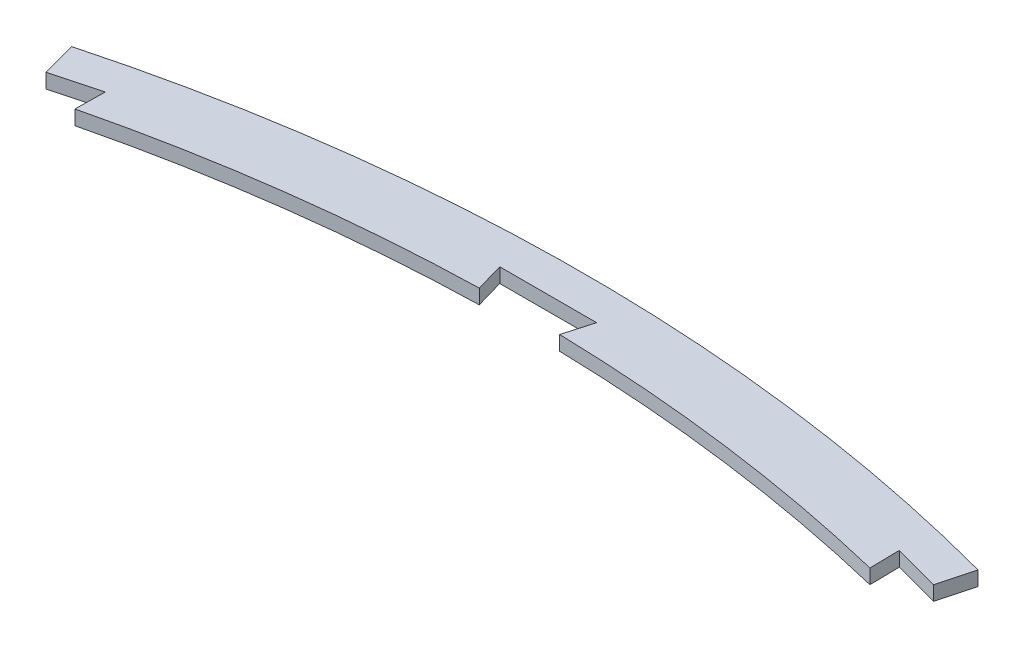
ISO-10303-21;
HEADER;
FILE_DESCRIPTION(('STEP AP214'),'2;1');
FILE_NAME('part.step','',(''),(''),'','','');
FILE_SCHEMA(('AUTOMOTIVE_DESIGN { 1 0 10303 214 1 1 1 1 }'));
ENDSEC;
DATA;
#1=APPLICATION_CONTEXT('core data for automotive mechanical design processes');
#2=APPLICATION_PROTOCOL_DEFINITION('international standard','automotive_design',2000,#1);
#3=PRODUCT_CONTEXT('',#1,'mechanical');
#4=PRODUCT('Part','Part','',(#3));
#5=PRODUCT_RELATED_PRODUCT_CATEGORY('part','',(#4));
#6=PRODUCT_DEFINITION_FORMATION('','',#4);
#7=PRODUCT_DEFINITION_CONTEXT('part definition',#1,'design');
#8=PRODUCT_DEFINITION('design','',#6,#7);
#9=PRODUCT_DEFINITION_SHAPE('','',#8);
#10=(LENGTH_UNIT() NAMED_UNIT(*) SI_UNIT(.MILLI.,.METRE.));
#11=(NAMED_UNIT(*) PLANE_ANGLE_UNIT() SI_UNIT($,.RADIAN.));
#12=(NAMED_UNIT(*) SI_UNIT($,.STERADIAN.) SOLID_ANGLE_UNIT());
#13=UNCERTAINTY_MEASURE_WITH_UNIT(LENGTH_MEASURE(1.E-05),#10,'distance_accuracy_value','');
#14=(GEOMETRIC_REPRESENTATION_CONTEXT(3) GLOBAL_UNCERTAINTY_ASSIGNED_CONTEXT((#13)) GLOBAL_UNIT_ASSIGNED_CONTEXT((#10,
#11,#12)) REPRESENTATION_CONTEXT('',''));
#15=CARTESIAN_POINT('',(0.,0.,0.));
#16=DIRECTION('',(0.,0.,1.));
#17=DIRECTION('',(1.,0.,0.));
#18=AXIS2_PLACEMENT_3D('',#15,#16,#17);
#19=CARTESIAN_POINT('',(0.,9.00000000000001,0.));
#20=DIRECTION('',(0.,-1.,0.));
#21=DIRECTION('',(0.,0.,-1.));
#22=AXIS2_PLACEMENT_3D('',#19,#20,#21);
#23=CYLINDRICAL_SURFACE('',#22,1045.);
#24=CARTESIAN_POINT('',(0.,0.,0.));
#25=DIRECTION('',(0.,1.,0.));
#26=DIRECTION('',(0.,0.,1.));
#27=AXIS2_PLACEMENT_3D('',#24,#25,#26);
#28=CIRCLE('',#27,1045.);
#29=CARTESIAN_POINT('',(246.322853924018,0.,-1015.55406140428));
#30=VERTEX_POINT('',#29);
#31=CARTESIAN_POINT('',(24.9151262121972,0.,-1044.70294174269));
#32=VERTEX_POINT('',#31);
#33=EDGE_CURVE('E173',#30,#32,#28,.T.);
#34=ORIENTED_EDGE('',*,*,#33,.F.);
#35=DIRECTION('',(0.,-1.,0.));
#36=VECTOR('',#35,1.);
#37=CARTESIAN_POINT('',(246.322853924018,9.00000000000001,-1015.55406140428));
#38=LINE('',#37,#36);
#39=CARTESIAN_POINT('',(246.322853924018,9.00000000000001,-1015.55406140428));
#40=VERTEX_POINT('',#39);
#41=EDGE_CURVE('E11',#40,#30,#38,.T.);
#42=ORIENTED_EDGE('',*,*,#41,.F.);
#43=CARTESIAN_POINT('',(0.,9.00000000000001,0.));
#44=DIRECTION('',(0.,1.,0.));
#45=DIRECTION('',(0.,0.,1.));
#46=AXIS2_PLACEMENT_3D('',#43,#44,#45);
#47=CIRCLE('',#46,1045.);
#48=CARTESIAN_POINT('',(24.9151262121972,9.00000000000001,-1044.70294174269));
#49=VERTEX_POINT('',#48);
#50=EDGE_CURVE('E212',#40,#49,#47,.T.);
#51=ORIENTED_EDGE('',*,*,#50,.T.);
#52=DIRECTION('',(0.,-1.,0.));
#53=VECTOR('',#52,1.);
#54=CARTESIAN_POINT('',(24.9151262121972,9.00000000000001,-1044.70294174269));
#55=LINE('',#54,#53);
#56=EDGE_CURVE('E113',#49,#32,#55,.T.);
#57=ORIENTED_EDGE('',*,*,#56,.T.);
#58=EDGE_LOOP('',(#34,#42,#51,#57));
#59=FACE_BOUND('',#58,.T.);
#60=ADVANCED_FACE('F49',(#59),#23,.F.);
#61=CARTESIAN_POINT('',(263.009672531202,9.00000000000001,-4.34012481301171));
#62=DIRECTION('',(-0.999863873613574,0.,0.0164995224918562));
#63=DIRECTION('',(0.0164995224918562,0.,0.999863873613574));
#64=AXIS2_PLACEMENT_3D('',#61,#62,#63);
#65=PLANE('',#64);
#66=DIRECTION('',(-0.0164995224918562,0.,-0.999863873613574));
#67=VECTOR('',#66,1.);
#68=CARTESIAN_POINT('',(263.009672531202,0.,-4.34012481301171));
#69=LINE('',#68,#67);
#70=CARTESIAN_POINT('',(246.01746063275,0.,-1034.06076178521));
#71=VERTEX_POINT('',#70);
#72=EDGE_CURVE('E177',#30,#71,#69,.T.);
#73=ORIENTED_EDGE('',*,*,#72,.T.);
#74=DIRECTION('',(0.,-1.,0.));
#75=VECTOR('',#74,1.);
#76=CARTESIAN_POINT('',(246.01746063275,9.00000000000001,-1034.06076178521));
#77=LINE('',#76,#75);
#78=CARTESIAN_POINT('',(246.01746063275,9.00000000000001,-1034.06076178521));
#79=VERTEX_POINT('',#78);
#80=EDGE_CURVE('E59',#79,#71,#77,.T.);
#81=ORIENTED_EDGE('',*,*,#80,.F.);
#82=DIRECTION('',(-0.0164995224918562,0.,-0.999863873613574));
#83=VECTOR('',#82,1.);
#84=CARTESIAN_POINT('',(263.009672531202,9.00000000000001,-4.34012481301171));
#85=LINE('',#84,#83);
#86=EDGE_CURVE('E288',#40,#79,#85,.T.);
#87=ORIENTED_EDGE('',*,*,#86,.F.);
#88=ORIENTED_EDGE('',*,*,#41,.T.);
#89=EDGE_LOOP('',(#73,#81,#87,#88));
#90=FACE_BOUND('',#89,.T.);
#91=ADVANCED_FACE('F51',(#90),#65,.F.);
#92=CARTESIAN_POINT('',(274.99523542142,9.00000000000001,-1026.29619043214));
#93=DIRECTION('',(-0.258819045102513,0.,0.96592582628907));
#94=DIRECTION('',(0.96592582628907,0.,0.258819045102513));
#95=AXIS2_PLACEMENT_3D('',#92,#93,#94);
#96=PLANE('',#95);
#97=DIRECTION('',(-0.965925826289071,0.,-0.258819045102513));
#98=VECTOR('',#97,1.);
#99=CARTESIAN_POINT('',(274.99523542142,0.,-1026.29619043214));
#100=LINE('',#99,#98);
#101=CARTESIAN_POINT('',(274.995235421422,0.,-1026.29619043214));
#102=VERTEX_POINT('',#101);
#103=EDGE_CURVE('E182',#102,#71,#100,.T.);
#104=ORIENTED_EDGE('',*,*,#103,.F.);
#105=DIRECTION('',(0.,-1.,0.));
#106=VECTOR('',#105,1.);
#107=CARTESIAN_POINT('',(274.995235421422,9.00000000000001,-1026.29619043214));
#108=LINE('',#107,#106);
#109=CARTESIAN_POINT('',(274.995235421422,9.00000000000001,-1026.29619043214));
#110=VERTEX_POINT('',#109);
#111=EDGE_CURVE('E236',#110,#102,#108,.T.);
#112=ORIENTED_EDGE('',*,*,#111,.F.);
#113=DIRECTION('',(-0.965925826289071,0.,-0.258819045102513));
#114=VECTOR('',#113,1.);
#115=CARTESIAN_POINT('',(274.99523542142,9.00000000000001,-1026.29619043214));
#116=LINE('',#115,#114);
#117=EDGE_CURVE('E246',#110,#79,#116,.T.);
#118=ORIENTED_EDGE('',*,*,#117,.T.);
#119=ORIENTED_EDGE('',*,*,#80,.T.);
#120=EDGE_LOOP('',(#104,#112,#118,#119));
#121=FACE_BOUND('',#120,.T.);
#122=ADVANCED_FACE('F244',(#121),#96,.T.);
#123=CARTESIAN_POINT('',(0.,9.00000000000001,0.));
#124=DIRECTION('',(-0.96592582628907,0.,-0.258819045102515));
#125=DIRECTION('',(-0.258819045102515,0.,0.96592582628907));
#126=AXIS2_PLACEMENT_3D('',#123,#124,#125);
#127=PLANE('',#126);
#128=DIRECTION('',(0.258819045102515,0.,-0.96592582628907));
#129=VECTOR('',#128,1.);
#130=CARTESIAN_POINT('',(0.,0.,0.));
#131=LINE('',#130,#129);
#132=CARTESIAN_POINT('',(280.818663936228,0.,-1048.02952152364));
#133=VERTEX_POINT('',#132);
#134=EDGE_CURVE('E186',#102,#133,#131,.T.);
#135=ORIENTED_EDGE('',*,*,#134,.T.);
#136=DIRECTION('',(0.,-1.,0.));
#137=VECTOR('',#136,1.);
#138=CARTESIAN_POINT('',(280.818663936228,9.00000000000001,-1048.02952152364));
#139=LINE('',#138,#137);
#140=CARTESIAN_POINT('',(280.818663936228,9.00000000000001,-1048.02952152364));
#141=VERTEX_POINT('',#140);
#142=EDGE_CURVE('E232',#141,#133,#139,.T.);
#143=ORIENTED_EDGE('',*,*,#142,.F.);
#144=DIRECTION('',(0.258819045102515,0.,-0.96592582628907));
#145=VECTOR('',#144,1.);
#146=CARTESIAN_POINT('',(0.,9.00000000000001,0.));
#147=LINE('',#146,#145);
#148=EDGE_CURVE('E266',#110,#141,#147,.T.);
#149=ORIENTED_EDGE('',*,*,#148,.F.);
#150=ORIENTED_EDGE('',*,*,#111,.T.);
#151=EDGE_LOOP('',(#135,#143,#149,#150));
#152=FACE_BOUND('',#151,.T.);
#153=ADVANCED_FACE('F255',(#152),#127,.F.);
#154=CARTESIAN_POINT('',(0.,9.00000000000001,0.));
#155=DIRECTION('',(0.,-1.,0.));
#156=DIRECTION('',(0.,0.,-1.));
#157=AXIS2_PLACEMENT_3D('',#154,#155,#156);
#158=CYLINDRICAL_SURFACE('',#157,1085.);
#159=CARTESIAN_POINT('',(0.,0.,0.));
#160=DIRECTION('',(0.,1.,0.));
#161=DIRECTION('',(0.,0.,1.));
#162=AXIS2_PLACEMENT_3D('',#159,#160,#161);
#163=CIRCLE('',#162,1085.);
#164=CARTESIAN_POINT('',(-280.818663936228,0.,-1048.02952152364));
#165=VERTEX_POINT('',#164);
#166=EDGE_CURVE('E189',#133,#165,#163,.T.);
#167=ORIENTED_EDGE('',*,*,#166,.T.);
#168=DIRECTION('',(0.,-1.,0.));
#169=VECTOR('',#168,1.);
#170=CARTESIAN_POINT('',(-280.818663936228,9.00000000000001,-1048.02952152364));
#171=LINE('',#170,#169);
#172=CARTESIAN_POINT('',(-280.818663936228,9.00000000000001,-1048.02952152364));
#173=VERTEX_POINT('',#172);
#174=EDGE_CURVE('E229',#173,#165,#171,.T.);
#175=ORIENTED_EDGE('',*,*,#174,.F.);
#176=CARTESIAN_POINT('',(0.,9.00000000000001,0.));
#177=DIRECTION('',(0.,1.,0.));
#178=DIRECTION('',(0.,0.,1.));
#179=AXIS2_PLACEMENT_3D('',#176,#177,#178);
#180=CIRCLE('',#179,1085.);
#181=EDGE_CURVE('E261',#141,#173,#180,.T.);
#182=ORIENTED_EDGE('',*,*,#181,.F.);
#183=ORIENTED_EDGE('',*,*,#142,.T.);
#184=EDGE_LOOP('',(#167,#175,#182,#183));
#185=FACE_BOUND('',#184,.T.);
#186=ADVANCED_FACE('F259',(#185),#158,.T.);
#187=CARTESIAN_POINT('',(0.,9.00000000000001,0.));
#188=DIRECTION('',(-0.96592582628907,0.,0.258819045102515));
#189=DIRECTION('',(0.258819045102515,0.,0.96592582628907));
#190=AXIS2_PLACEMENT_3D('',#187,#188,#189);
#191=PLANE('',#190);
#192=DIRECTION('',(-0.258819045102515,0.,-0.96592582628907));
#193=VECTOR('',#192,1.);
#194=CARTESIAN_POINT('',(0.,0.,0.));
#195=LINE('',#194,#193);
#196=CARTESIAN_POINT('',(-274.995235421422,0.,-1026.29619043214));
#197=VERTEX_POINT('',#196);
#198=EDGE_CURVE('E193',#197,#165,#195,.T.);
#199=ORIENTED_EDGE('',*,*,#198,.F.);
#200=DIRECTION('',(0.,-1.,0.));
#201=VECTOR('',#200,1.);
#202=CARTESIAN_POINT('',(-274.995235421422,9.00000000000001,-1026.29619043214));
#203=LINE('',#202,#201);
#204=CARTESIAN_POINT('',(-274.995235421422,9.00000000000001,-1026.29619043214));
#205=VERTEX_POINT('',#204);
#206=EDGE_CURVE('E226',#205,#197,#203,.T.);
#207=ORIENTED_EDGE('',*,*,#206,.F.);
#208=DIRECTION('',(-0.258819045102515,0.,-0.96592582628907));
#209=VECTOR('',#208,1.);
#210=CARTESIAN_POINT('',(0.,9.00000000000001,0.));
#211=LINE('',#210,#209);
#212=EDGE_CURVE('E265',#205,#173,#211,.T.);
#213=ORIENTED_EDGE('',*,*,#212,.T.);
#214=ORIENTED_EDGE('',*,*,#174,.T.);
#215=EDGE_LOOP('',(#199,#207,#213,#214));
#216=FACE_BOUND('',#215,.T.);
#217=ADVANCED_FACE('F380',(#216),#191,.T.);
#218=CARTESIAN_POINT('',(-274.99523542142,9.00000000000001,-1026.29619043214));
#219=DIRECTION('',(-0.258819045102513,0.,-0.96592582628907));
#220=DIRECTION('',(-0.96592582628907,0.,0.258819045102513));
#221=AXIS2_PLACEMENT_3D('',#218,#219,#220);
#222=PLANE('',#221);
#223=DIRECTION('',(0.965925826289071,0.,-0.258819045102513));
#224=VECTOR('',#223,1.);
#225=CARTESIAN_POINT('',(-274.99523542142,0.,-1026.29619043214));
#226=LINE('',#225,#224);
#227=CARTESIAN_POINT('',(-246.01746063275,0.,-1034.06076178521));
#228=VERTEX_POINT('',#227);
#229=EDGE_CURVE('E197',#197,#228,#226,.T.);
#230=ORIENTED_EDGE('',*,*,#229,.T.);
#231=DIRECTION('',(0.,-1.,0.));
#232=VECTOR('',#231,1.);
#233=CARTESIAN_POINT('',(-246.01746063275,9.00000000000001,-1034.06076178521));
#234=LINE('',#233,#232);
#235=CARTESIAN_POINT('',(-246.01746063275,9.00000000000001,-1034.06076178521));
#236=VERTEX_POINT('',#235);
#237=EDGE_CURVE('E222',#236,#228,#234,.T.);
#238=ORIENTED_EDGE('',*,*,#237,.F.);
#239=DIRECTION('',(0.965925826289071,0.,-0.258819045102513));
#240=VECTOR('',#239,1.);
#241=CARTESIAN_POINT('',(-274.99523542142,9.00000000000001,-1026.29619043214));
#242=LINE('',#241,#240);
#243=EDGE_CURVE('E271',#205,#236,#242,.T.);
#244=ORIENTED_EDGE('',*,*,#243,.F.);
#245=ORIENTED_EDGE('',*,*,#206,.T.);
#246=EDGE_LOOP('',(#230,#238,#244,#245));
#247=FACE_BOUND('',#246,.T.);
#248=ADVANCED_FACE('F309',(#247),#222,.F.);
#249=CARTESIAN_POINT('',(-263.009672531089,9.00000000000001,-4.34012481298041));
#250=DIRECTION('',(0.999863873613576,0.,0.0164995224917443));
#251=DIRECTION('',(0.0164995224917443,0.,-0.999863873613576));
#252=AXIS2_PLACEMENT_3D('',#249,#250,#251);
#253=PLANE('',#252);
#254=DIRECTION('',(-0.0164995224917443,0.,0.999863873613576));
#255=VECTOR('',#254,1.);
#256=CARTESIAN_POINT('',(-263.009672531089,0.,-4.34012481298041));
#257=LINE('',#256,#255);
#258=CARTESIAN_POINT('',(-246.322853924018,0.,-1015.55406140428));
#259=VERTEX_POINT('',#258);
#260=EDGE_CURVE('E200',#228,#259,#257,.T.);
#261=ORIENTED_EDGE('',*,*,#260,.T.);
#262=DIRECTION('',(0.,-1.,0.));
#263=VECTOR('',#262,1.);
#264=CARTESIAN_POINT('',(-246.322853924018,9.00000000000001,-1015.55406140428));
#265=LINE('',#264,#263);
#266=CARTESIAN_POINT('',(-246.322853924018,9.00000000000001,-1015.55406140428));
#267=VERTEX_POINT('',#266);
#268=EDGE_CURVE('E219',#267,#259,#265,.T.);
#269=ORIENTED_EDGE('',*,*,#268,.F.);
#270=DIRECTION('',(-0.0164995224917443,0.,0.999863873613576));
#271=VECTOR('',#270,1.);
#272=CARTESIAN_POINT('',(-263.009672531089,9.00000000000001,-4.34012481298041));
#273=LINE('',#272,#271);
#274=EDGE_CURVE('E277',#236,#267,#273,.T.);
#275=ORIENTED_EDGE('',*,*,#274,.F.);
#276=ORIENTED_EDGE('',*,*,#237,.T.);
#277=EDGE_LOOP('',(#261,#269,#275,#276));
#278=FACE_BOUND('',#277,.T.);
#279=ADVANCED_FACE('F304',(#278),#253,.F.);
#280=CARTESIAN_POINT('',(-24.9151262121971,0.,-1044.70294174269));
#281=VERTEX_POINT('',#280);
#282=EDGE_CURVE('E178',#281,#259,#28,.T.);
#283=ORIENTED_EDGE('',*,*,#282,.F.);
#284=DIRECTION('',(0.,-1.,0.));
#285=VECTOR('',#284,1.);
#286=CARTESIAN_POINT('',(-24.9151262121971,9.00000000000001,-1044.70294174269));
#287=LINE('',#286,#285);
#288=CARTESIAN_POINT('',(-24.9151262121971,9.00000000000001,-1044.70294174269));
#289=VERTEX_POINT('',#288);
#290=EDGE_CURVE('E163',#289,#281,#287,.T.);
#291=ORIENTED_EDGE('',*,*,#290,.F.);
#292=EDGE_CURVE('E150',#289,#267,#47,.T.);
#293=ORIENTED_EDGE('',*,*,#292,.T.);
#294=ORIENTED_EDGE('',*,*,#268,.T.);
#295=EDGE_LOOP('',(#283,#291,#293,#294));
#296=FACE_BOUND('',#295,.T.);
#297=ADVANCED_FACE('F297',(#296),#23,.F.);
#298=CARTESIAN_POINT('',(252.92452830193,9.00000000000001,-72.2641509434216));
#299=DIRECTION('',(-0.96152394764081,0.,0.274721127897424));
#300=DIRECTION('',(0.274721127897424,0.,0.96152394764081));
#301=AXIS2_PLACEMENT_3D('',#298,#299,#300);
#302=PLANE('',#301);
#303=DIRECTION('',(-0.274721127897424,0.,-0.96152394764081));
#304=VECTOR('',#303,1.);
#305=CARTESIAN_POINT('',(252.92452830193,0.,-72.2641509434216));
#306=LINE('',#305,#304);
#307=CARTESIAN_POINT('',(-30.,0.,-1062.5));
#308=VERTEX_POINT('',#307);
#309=EDGE_CURVE('E158',#281,#308,#306,.T.);
#310=ORIENTED_EDGE('',*,*,#309,.T.);
#311=DIRECTION('',(0.,-1.,0.));
#312=VECTOR('',#311,1.);
#313=CARTESIAN_POINT('',(-30.,9.00000000000001,-1062.5));
#314=LINE('',#313,#312);
#315=CARTESIAN_POINT('',(-30.,9.00000000000001,-1062.5));
#316=VERTEX_POINT('',#315);
#317=EDGE_CURVE('E155',#316,#308,#314,.T.);
#318=ORIENTED_EDGE('',*,*,#317,.F.);
#319=DIRECTION('',(-0.274721127897424,0.,-0.96152394764081));
#320=VECTOR('',#319,1.);
#321=CARTESIAN_POINT('',(252.92452830193,9.00000000000001,-72.2641509434216));
#322=LINE('',#321,#320);
#323=EDGE_CURVE('E144',#289,#316,#322,.T.);
#324=ORIENTED_EDGE('',*,*,#323,.F.);
#325=ORIENTED_EDGE('',*,*,#290,.T.);
#326=EDGE_LOOP('',(#310,#318,#324,#325));
#327=FACE_BOUND('',#326,.T.);
#328=ADVANCED_FACE('F156',(#327),#302,.F.);
#329=CARTESIAN_POINT('',(0.,9.00000000000001,-1062.5));
#330=DIRECTION('',(0.,0.,1.));
#331=DIRECTION('',(1.,0.,0.));
#332=AXIS2_PLACEMENT_3D('',#329,#330,#331);
#333=PLANE('',#332);
#334=DIRECTION('',(-1.,0.,0.));
#335=VECTOR('',#334,1.);
#336=CARTESIAN_POINT('',(0.,0.,-1062.5));
#337=LINE('',#336,#335);
#338=CARTESIAN_POINT('',(30.,0.,-1062.5));
#339=VERTEX_POINT('',#338);
#340=EDGE_CURVE('E206',#339,#308,#337,.T.);
#341=ORIENTED_EDGE('',*,*,#340,.F.);
#342=DIRECTION('',(0.,-1.,0.));
#343=VECTOR('',#342,1.);
#344=CARTESIAN_POINT('',(30.,9.00000000000001,-1062.5));
#345=LINE('',#344,#343);
#346=CARTESIAN_POINT('',(30.,9.00000000000001,-1062.5));
#347=VERTEX_POINT('',#346);
#348=EDGE_CURVE('E106',#347,#339,#345,.T.);
#349=ORIENTED_EDGE('',*,*,#348,.F.);
#350=DIRECTION('',(-1.,0.,0.));
#351=VECTOR('',#350,1.);
#352=CARTESIAN_POINT('',(0.,9.00000000000001,-1062.5));
#353=LINE('',#352,#351);
#354=EDGE_CURVE('E148',#347,#316,#353,.T.);
#355=ORIENTED_EDGE('',*,*,#354,.T.);
#356=ORIENTED_EDGE('',*,*,#317,.T.);
#357=EDGE_LOOP('',(#341,#349,#355,#356));
#358=FACE_BOUND('',#357,.T.);
#359=ADVANCED_FACE('F165',(#358),#333,.T.);
#360=CARTESIAN_POINT('',(-252.924528301887,9.00000000000001,-72.2641509433961));
#361=DIRECTION('',(0.961523947640823,0.,0.274721127897378));
#362=DIRECTION('',(0.274721127897378,0.,-0.961523947640823));
#363=AXIS2_PLACEMENT_3D('',#360,#361,#362);
#364=PLANE('',#363);
#365=DIRECTION('',(-0.274721127897378,0.,0.961523947640823));
#366=VECTOR('',#365,1.);
#367=CARTESIAN_POINT('',(-252.924528301887,0.,-72.2641509433961));
#368=LINE('',#367,#366);
#369=EDGE_CURVE('E209',#339,#32,#368,.T.);
#370=ORIENTED_EDGE('',*,*,#369,.T.);
#371=ORIENTED_EDGE('',*,*,#56,.F.);
#372=DIRECTION('',(-0.274721127897378,0.,0.961523947640823));
#373=VECTOR('',#372,1.);
#374=CARTESIAN_POINT('',(-252.924528301887,9.00000000000001,-72.2641509433961));
#375=LINE('',#374,#373);
#376=EDGE_CURVE('E67',#347,#49,#375,.T.);
#377=ORIENTED_EDGE('',*,*,#376,.F.);
#378=ORIENTED_EDGE('',*,*,#348,.T.);
#379=EDGE_LOOP('',(#370,#371,#377,#378));
#380=FACE_BOUND('',#379,.T.);
#381=ADVANCED_FACE('F328',(#380),#364,.F.);
#382=CARTESIAN_POINT('',(0.,9.00000000000001,0.));
#383=DIRECTION('',(0.,1.,0.));
#384=DIRECTION('',(0.,0.,1.));
#385=AXIS2_PLACEMENT_3D('',#382,#383,#384);
#386=PLANE('',#385);
#387=ORIENTED_EDGE('',*,*,#50,.F.);
#388=ORIENTED_EDGE('',*,*,#86,.T.);
#389=ORIENTED_EDGE('',*,*,#117,.F.);
#390=ORIENTED_EDGE('',*,*,#148,.T.);
#391=ORIENTED_EDGE('',*,*,#181,.T.);
#392=ORIENTED_EDGE('',*,*,#212,.F.);
#393=ORIENTED_EDGE('',*,*,#243,.T.);
#394=ORIENTED_EDGE('',*,*,#274,.T.);
#395=ORIENTED_EDGE('',*,*,#292,.F.);
#396=ORIENTED_EDGE('',*,*,#323,.T.);
#397=ORIENTED_EDGE('',*,*,#354,.F.);
#398=ORIENTED_EDGE('',*,*,#376,.T.);
#399=EDGE_LOOP('',(#387,#388,#389,#390,#391,#392,#393,#394,#395,#396,#397,#398));
#400=FACE_BOUND('',#399,.T.);
#401=ADVANCED_FACE('F146',(#400),#386,.T.);
#402=CARTESIAN_POINT('',(0.,0.,0.));
#403=DIRECTION('',(0.,1.,0.));
#404=DIRECTION('',(0.,0.,1.));
#405=AXIS2_PLACEMENT_3D('',#402,#403,#404);
#406=PLANE('',#405);
#407=ORIENTED_EDGE('',*,*,#33,.T.);
#408=ORIENTED_EDGE('',*,*,#369,.F.);
#409=ORIENTED_EDGE('',*,*,#340,.T.);
#410=ORIENTED_EDGE('',*,*,#309,.F.);
#411=ORIENTED_EDGE('',*,*,#282,.T.);
#412=ORIENTED_EDGE('',*,*,#260,.F.);
#413=ORIENTED_EDGE('',*,*,#229,.F.);
#414=ORIENTED_EDGE('',*,*,#198,.T.);
#415=ORIENTED_EDGE('',*,*,#166,.F.);
#416=ORIENTED_EDGE('',*,*,#134,.F.);
#417=ORIENTED_EDGE('',*,*,#103,.T.);
#418=ORIENTED_EDGE('',*,*,#72,.F.);
#419=EDGE_LOOP('',(#407,#408,#409,#410,#411,#412,#413,#414,#415,#416,#417,#418));
#420=FACE_BOUND('',#419,.T.);
#421=ADVANCED_FACE('F251',(#420),#406,.F.);
#422=CLOSED_SHELL('',(#60,#91,#122,#153,#186,#217,#248,#279,#297,#328,#359,#381,#401,#421));
#423=MANIFOLD_SOLID_BREP('B2',#422);
#424=ADVANCED_BREP_SHAPE_REPRESENTATION('',(#18,#423),#14);
#425=SHAPE_DEFINITION_REPRESENTATION(#9,#424);
ENDSEC;
END-ISO-10303-21;
